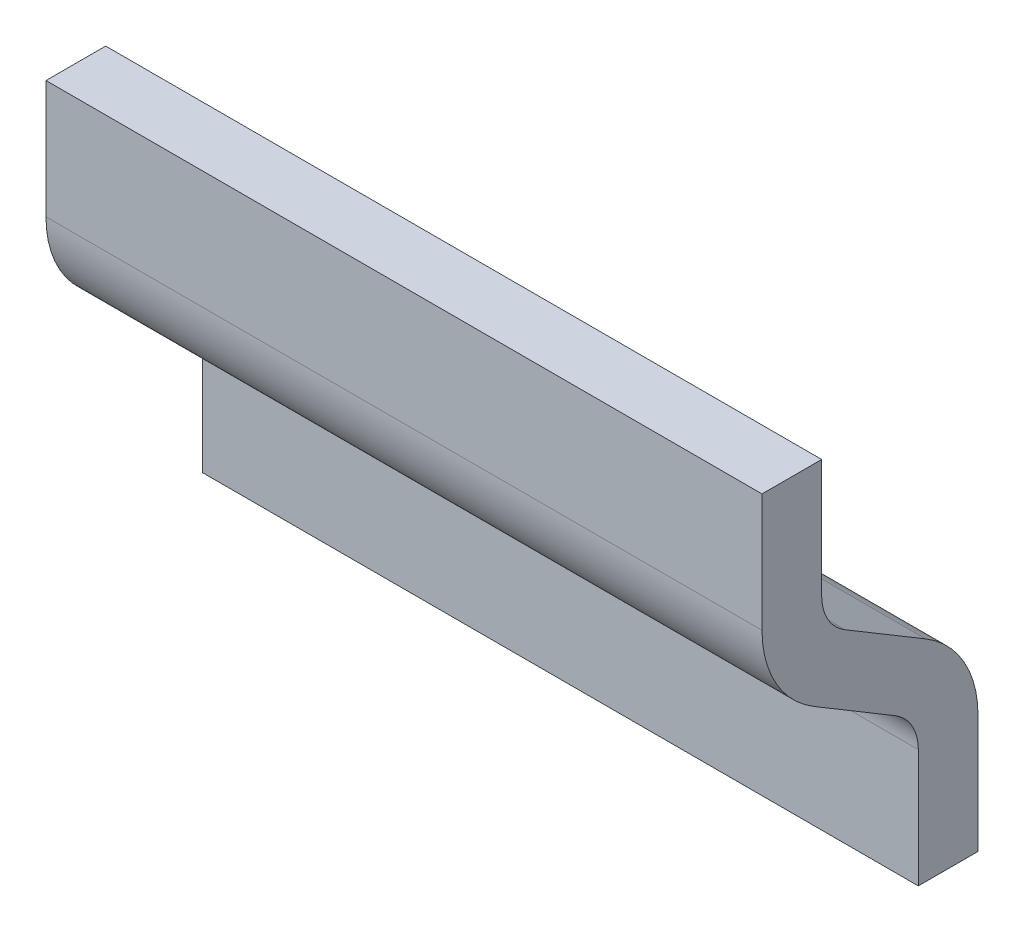
ISO-10303-21;
HEADER;
FILE_DESCRIPTION(('STEP AP214'),'2;1');
FILE_NAME('part.step','',(''),(''),'','','');
FILE_SCHEMA(('AUTOMOTIVE_DESIGN { 1 0 10303 214 1 1 1 1 }'));
ENDSEC;
DATA;
#1=APPLICATION_CONTEXT('core data for automotive mechanical design processes');
#2=APPLICATION_PROTOCOL_DEFINITION('international standard','automotive_design',2000,#1);
#3=PRODUCT_CONTEXT('',#1,'mechanical');
#4=PRODUCT('Part','Part','',(#3));
#5=PRODUCT_RELATED_PRODUCT_CATEGORY('part','',(#4));
#6=PRODUCT_DEFINITION_FORMATION('','',#4);
#7=PRODUCT_DEFINITION_CONTEXT('part definition',#1,'design');
#8=PRODUCT_DEFINITION('design','',#6,#7);
#9=PRODUCT_DEFINITION_SHAPE('','',#8);
#10=(LENGTH_UNIT() NAMED_UNIT(*) SI_UNIT(.MILLI.,.METRE.));
#11=(NAMED_UNIT(*) PLANE_ANGLE_UNIT() SI_UNIT($,.RADIAN.));
#12=(NAMED_UNIT(*) SI_UNIT($,.STERADIAN.) SOLID_ANGLE_UNIT());
#13=UNCERTAINTY_MEASURE_WITH_UNIT(LENGTH_MEASURE(1.E-05),#10,'distance_accuracy_value','');
#14=(GEOMETRIC_REPRESENTATION_CONTEXT(3) GLOBAL_UNCERTAINTY_ASSIGNED_CONTEXT((#13)) GLOBAL_UNIT_ASSIGNED_CONTEXT((#10,
#11,#12)) REPRESENTATION_CONTEXT('',''));
#15=CARTESIAN_POINT('',(0.,0.,0.));
#16=DIRECTION('',(0.,0.,1.));
#17=DIRECTION('',(1.,0.,0.));
#18=AXIS2_PLACEMENT_3D('',#15,#16,#17);
#19=CARTESIAN_POINT('',(0.,8.34480519481,-1.975));
#20=DIRECTION('',(1.,0.,0.));
#21=DIRECTION('',(0.,-0.493297580616371,0.869860619270717));
#22=AXIS2_PLACEMENT_3D('',#19,#20,#21);
#23=CYLINDRICAL_SURFACE('',#22,0.45);
#24=DIRECTION('',(1.,0.,0.));
#25=VECTOR('',#24,1.);
#26=CARTESIAN_POINT('',(0.,8.34480519481,-2.425));
#27=LINE('',#26,#25);
#28=CARTESIAN_POINT('',(-1.5,8.34480519481,-2.425));
#29=VERTEX_POINT('',#28);
#30=CARTESIAN_POINT('',(1.5,8.34480519481,-2.425));
#31=VERTEX_POINT('',#30);
#32=EDGE_CURVE('E11',#29,#31,#27,.T.);
#33=ORIENTED_EDGE('',*,*,#32,.F.);
#34=CARTESIAN_POINT('',(-1.5,8.34480519481,-1.975));
#35=DIRECTION('',(1.,0.,0.));
#36=DIRECTION('',(0.,-1.,0.));
#37=AXIS2_PLACEMENT_3D('',#34,#35,#36);
#38=CIRCLE('',#37,0.45);
#39=CARTESIAN_POINT('',(-1.5,8.73099531987,-2.20599174726));
#40=VERTEX_POINT('',#39);
#41=EDGE_CURVE('E25',#29,#40,#38,.T.);
#42=ORIENTED_EDGE('',*,*,#41,.T.);
#43=DIRECTION('',(1.,0.,0.));
#44=VECTOR('',#43,1.);
#45=CARTESIAN_POINT('',(0.,8.73099531987,-2.20599174726));
#46=LINE('',#45,#44);
#47=CARTESIAN_POINT('',(1.5,8.73099531987,-2.20599174726));
#48=VERTEX_POINT('',#47);
#49=EDGE_CURVE('E124',#40,#48,#46,.T.);
#50=ORIENTED_EDGE('',*,*,#49,.T.);
#51=CARTESIAN_POINT('',(1.5,8.34480519481,-1.975));
#52=DIRECTION('',(1.,0.,0.));
#53=DIRECTION('',(0.,-1.,0.));
#54=AXIS2_PLACEMENT_3D('',#51,#52,#53);
#55=CIRCLE('',#54,0.45);
#56=EDGE_CURVE('E223',#31,#48,#55,.T.);
#57=ORIENTED_EDGE('',*,*,#56,.F.);
#58=EDGE_LOOP('',(#33,#42,#50,#57));
#59=FACE_BOUND('',#58,.T.);
#60=ADVANCED_FACE('F17',(#59),#23,.T.);
#61=CARTESIAN_POINT('',(1.5,6.1,-1.5));
#62=DIRECTION('',(1.,0.,0.));
#63=DIRECTION('',(0.,-1.,0.));
#64=AXIS2_PLACEMENT_3D('',#61,#62,#63);
#65=PLANE('',#64);
#66=ORIENTED_EDGE('',*,*,#56,.T.);
#67=DIRECTION('',(0.,-0.513314993903098,-0.858200277927164));
#68=VECTOR('',#67,1.);
#69=CARTESIAN_POINT('',(1.5,8.83227503474,-2.03666437424));
#70=LINE('',#69,#68);
#71=CARTESIAN_POINT('',(1.5,8.93355474961,-1.86733700122));
#72=VERTEX_POINT('',#71);
#73=EDGE_CURVE('E219',#72,#48,#70,.T.);
#74=ORIENTED_EDGE('',*,*,#73,.F.);
#75=CARTESIAN_POINT('',(1.5,9.10519480519,-1.97));
#76=DIRECTION('',(1.,0.,0.));
#77=DIRECTION('',(0.,-1.,0.));
#78=AXIS2_PLACEMENT_3D('',#75,#76,#77);
#79=CIRCLE('',#78,0.2);
#80=CARTESIAN_POINT('',(1.5,9.10519480519,-1.77));
#81=VERTEX_POINT('',#80);
#82=EDGE_CURVE('E118',#81,#72,#79,.T.);
#83=ORIENTED_EDGE('',*,*,#82,.F.);
#84=DIRECTION('',(0.,-1.,0.));
#85=VECTOR('',#84,1.);
#86=CARTESIAN_POINT('',(1.5,9.3525974026,-1.77));
#87=LINE('',#86,#85);
#88=CARTESIAN_POINT('',(1.5,9.6,-1.77));
#89=VERTEX_POINT('',#88);
#90=EDGE_CURVE('E211',#89,#81,#87,.T.);
#91=ORIENTED_EDGE('',*,*,#90,.F.);
#92=DIRECTION('',(0.,0.,-1.));
#93=VECTOR('',#92,1.);
#94=CARTESIAN_POINT('',(1.5,9.6,-1.645));
#95=LINE('',#94,#93);
#96=CARTESIAN_POINT('',(1.5,9.6,-1.52));
#97=VERTEX_POINT('',#96);
#98=EDGE_CURVE('E206',#97,#89,#95,.T.);
#99=ORIENTED_EDGE('',*,*,#98,.F.);
#100=DIRECTION('',(0.,1.,0.));
#101=VECTOR('',#100,1.);
#102=CARTESIAN_POINT('',(1.5,9.3525974026,-1.52));
#103=LINE('',#102,#101);
#104=CARTESIAN_POINT('',(1.5,9.10519480519,-1.52));
#105=VERTEX_POINT('',#104);
#106=EDGE_CURVE('E201',#105,#97,#103,.T.);
#107=ORIENTED_EDGE('',*,*,#106,.F.);
#108=CARTESIAN_POINT('',(1.5,9.10519480519,-1.97));
#109=DIRECTION('',(1.,0.,0.));
#110=DIRECTION('',(0.,-1.,0.));
#111=AXIS2_PLACEMENT_3D('',#108,#109,#110);
#112=CIRCLE('',#111,0.45);
#113=CARTESIAN_POINT('',(1.5,8.71900468013,-1.73900825274));
#114=VERTEX_POINT('',#113);
#115=EDGE_CURVE('E197',#105,#114,#112,.T.);
#116=ORIENTED_EDGE('',*,*,#115,.T.);
#117=DIRECTION('',(0.,0.513314993903098,0.858200277927164));
#118=VECTOR('',#117,1.);
#119=CARTESIAN_POINT('',(1.5,8.61772496526,-1.90833562576));
#120=LINE('',#119,#118);
#121=CARTESIAN_POINT('',(1.5,8.51644525039,-2.07766299878));
#122=VERTEX_POINT('',#121);
#123=EDGE_CURVE('E192',#122,#114,#120,.T.);
#124=ORIENTED_EDGE('',*,*,#123,.F.);
#125=CARTESIAN_POINT('',(1.5,8.34480519481,-1.975));
#126=DIRECTION('',(1.,0.,0.));
#127=DIRECTION('',(0.,-1.,0.));
#128=AXIS2_PLACEMENT_3D('',#125,#126,#127);
#129=CIRCLE('',#128,0.2);
#130=CARTESIAN_POINT('',(1.5,8.34480519481,-2.175));
#131=VERTEX_POINT('',#130);
#132=EDGE_CURVE('E187',#131,#122,#129,.T.);
#133=ORIENTED_EDGE('',*,*,#132,.F.);
#134=DIRECTION('',(0.,1.,0.));
#135=VECTOR('',#134,1.);
#136=CARTESIAN_POINT('',(1.5,8.0974025974,-2.175));
#137=LINE('',#136,#135);
#138=CARTESIAN_POINT('',(1.5,7.85,-2.175));
#139=VERTEX_POINT('',#138);
#140=EDGE_CURVE('E182',#139,#131,#137,.T.);
#141=ORIENTED_EDGE('',*,*,#140,.F.);
#142=DIRECTION('',(0.,0.,1.));
#143=VECTOR('',#142,1.);
#144=CARTESIAN_POINT('',(1.5,7.85,-2.3));
#145=LINE('',#144,#143);
#146=CARTESIAN_POINT('',(1.5,7.85,-2.425));
#147=VERTEX_POINT('',#146);
#148=EDGE_CURVE('E177',#147,#139,#145,.T.);
#149=ORIENTED_EDGE('',*,*,#148,.F.);
#150=DIRECTION('',(0.,-1.,0.));
#151=VECTOR('',#150,1.);
#152=CARTESIAN_POINT('',(1.5,8.0974025974,-2.425));
#153=LINE('',#152,#151);
#154=EDGE_CURVE('E172',#31,#147,#153,.T.);
#155=ORIENTED_EDGE('',*,*,#154,.F.);
#156=EDGE_LOOP('',(#66,#74,#83,#91,#99,#107,#116,#124,#133,#141,#149,#155));
#157=FACE_BOUND('',#156,.T.);
#158=ADVANCED_FACE('F237',(#157),#65,.T.);
#159=CARTESIAN_POINT('',(0.,3.85519480519,-2.425));
#160=DIRECTION('',(0.,0.,-1.));
#161=DIRECTION('',(0.,1.,0.));
#162=AXIS2_PLACEMENT_3D('',#159,#160,#161);
#163=PLANE('',#162);
#164=DIRECTION('',(1.,0.,0.));
#165=VECTOR('',#164,1.);
#166=CARTESIAN_POINT('',(0.,7.85,-2.425));
#167=LINE('',#166,#165);
#168=CARTESIAN_POINT('',(-1.5,7.85,-2.425));
#169=VERTEX_POINT('',#168);
#170=EDGE_CURVE('E167',#169,#147,#167,.T.);
#171=ORIENTED_EDGE('',*,*,#170,.F.);
#172=DIRECTION('',(0.,-1.,0.));
#173=VECTOR('',#172,1.);
#174=CARTESIAN_POINT('',(-1.5,8.0974025974,-2.425));
#175=LINE('',#174,#173);
#176=EDGE_CURVE('E163',#29,#169,#175,.T.);
#177=ORIENTED_EDGE('',*,*,#176,.F.);
#178=ORIENTED_EDGE('',*,*,#32,.T.);
#179=ORIENTED_EDGE('',*,*,#154,.T.);
#180=EDGE_LOOP('',(#171,#177,#178,#179));
#181=FACE_BOUND('',#180,.T.);
#182=ADVANCED_FACE('F239',(#181),#163,.T.);
#183=CARTESIAN_POINT('',(-1.5,6.1,-1.5));
#184=DIRECTION('',(1.,0.,0.));
#185=DIRECTION('',(0.,-1.,0.));
#186=AXIS2_PLACEMENT_3D('',#183,#184,#185);
#187=PLANE('',#186);
#188=ORIENTED_EDGE('',*,*,#176,.T.);
#189=DIRECTION('',(0.,0.,1.));
#190=VECTOR('',#189,1.);
#191=CARTESIAN_POINT('',(-1.5,7.85,-2.3));
#192=LINE('',#191,#190);
#193=CARTESIAN_POINT('',(-1.5,7.85,-2.175));
#194=VERTEX_POINT('',#193);
#195=EDGE_CURVE('E159',#169,#194,#192,.T.);
#196=ORIENTED_EDGE('',*,*,#195,.T.);
#197=DIRECTION('',(0.,1.,0.));
#198=VECTOR('',#197,1.);
#199=CARTESIAN_POINT('',(-1.5,8.0974025974,-2.175));
#200=LINE('',#199,#198);
#201=CARTESIAN_POINT('',(-1.5,8.34480519481,-2.175));
#202=VERTEX_POINT('',#201);
#203=EDGE_CURVE('E155',#194,#202,#200,.T.);
#204=ORIENTED_EDGE('',*,*,#203,.T.);
#205=CARTESIAN_POINT('',(-1.5,8.34480519481,-1.975));
#206=DIRECTION('',(1.,0.,0.));
#207=DIRECTION('',(0.,-1.,0.));
#208=AXIS2_PLACEMENT_3D('',#205,#206,#207);
#209=CIRCLE('',#208,0.2);
#210=CARTESIAN_POINT('',(-1.5,8.51644525039,-2.07766299878));
#211=VERTEX_POINT('',#210);
#212=EDGE_CURVE('E151',#202,#211,#209,.T.);
#213=ORIENTED_EDGE('',*,*,#212,.T.);
#214=DIRECTION('',(0.,0.513314993903098,0.858200277927164));
#215=VECTOR('',#214,1.);
#216=CARTESIAN_POINT('',(-1.5,8.61772496526,-1.90833562576));
#217=LINE('',#216,#215);
#218=CARTESIAN_POINT('',(-1.5,8.71900468013,-1.73900825274));
#219=VERTEX_POINT('',#218);
#220=EDGE_CURVE('E147',#211,#219,#217,.T.);
#221=ORIENTED_EDGE('',*,*,#220,.T.);
#222=CARTESIAN_POINT('',(-1.5,9.10519480519,-1.97));
#223=DIRECTION('',(1.,0.,0.));
#224=DIRECTION('',(0.,-1.,0.));
#225=AXIS2_PLACEMENT_3D('',#222,#223,#224);
#226=CIRCLE('',#225,0.45);
#227=CARTESIAN_POINT('',(-1.5,9.10519480519,-1.52));
#228=VERTEX_POINT('',#227);
#229=EDGE_CURVE('E142',#228,#219,#226,.T.);
#230=ORIENTED_EDGE('',*,*,#229,.F.);
#231=DIRECTION('',(0.,1.,0.));
#232=VECTOR('',#231,1.);
#233=CARTESIAN_POINT('',(-1.5,9.3525974026,-1.52));
#234=LINE('',#233,#232);
#235=CARTESIAN_POINT('',(-1.5,9.6,-1.52));
#236=VERTEX_POINT('',#235);
#237=EDGE_CURVE('E138',#228,#236,#234,.T.);
#238=ORIENTED_EDGE('',*,*,#237,.T.);
#239=DIRECTION('',(0.,0.,-1.));
#240=VECTOR('',#239,1.);
#241=CARTESIAN_POINT('',(-1.5,9.6,-1.645));
#242=LINE('',#241,#240);
#243=CARTESIAN_POINT('',(-1.5,9.6,-1.77));
#244=VERTEX_POINT('',#243);
#245=EDGE_CURVE('E134',#236,#244,#242,.T.);
#246=ORIENTED_EDGE('',*,*,#245,.T.);
#247=DIRECTION('',(0.,-1.,0.));
#248=VECTOR('',#247,1.);
#249=CARTESIAN_POINT('',(-1.5,9.3525974026,-1.77));
#250=LINE('',#249,#248);
#251=CARTESIAN_POINT('',(-1.5,9.10519480519,-1.77));
#252=VERTEX_POINT('',#251);
#253=EDGE_CURVE('E109',#244,#252,#250,.T.);
#254=ORIENTED_EDGE('',*,*,#253,.T.);
#255=CARTESIAN_POINT('',(-1.5,9.10519480519,-1.97));
#256=DIRECTION('',(1.,0.,0.));
#257=DIRECTION('',(0.,-1.,0.));
#258=AXIS2_PLACEMENT_3D('',#255,#256,#257);
#259=CIRCLE('',#258,0.2);
#260=CARTESIAN_POINT('',(-1.5,8.93355474961,-1.86733700122));
#261=VERTEX_POINT('',#260);
#262=EDGE_CURVE('E101',#252,#261,#259,.T.);
#263=ORIENTED_EDGE('',*,*,#262,.T.);
#264=DIRECTION('',(0.,-0.513314993903098,-0.858200277927164));
#265=VECTOR('',#264,1.);
#266=CARTESIAN_POINT('',(-1.5,8.83227503474,-2.03666437424));
#267=LINE('',#266,#265);
#268=EDGE_CURVE('E106',#261,#40,#267,.T.);
#269=ORIENTED_EDGE('',*,*,#268,.T.);
#270=ORIENTED_EDGE('',*,*,#41,.F.);
#271=EDGE_LOOP('',(#188,#196,#204,#213,#221,#230,#238,#246,#254,#263,#269,#270));
#272=FACE_BOUND('',#271,.T.);
#273=ADVANCED_FACE('F104',(#272),#187,.F.);
#274=CARTESIAN_POINT('',(0.,8.93355474961,-1.86733700122));
#275=DIRECTION('',(0.,-0.858200277927164,0.513314993903098));
#276=DIRECTION('',(0.,-0.513314993903098,-0.858200277927164));
#277=AXIS2_PLACEMENT_3D('',#274,#275,#276);
#278=PLANE('',#277);
#279=ORIENTED_EDGE('',*,*,#49,.F.);
#280=ORIENTED_EDGE('',*,*,#268,.F.);
#281=DIRECTION('',(1.,0.,0.));
#282=VECTOR('',#281,1.);
#283=CARTESIAN_POINT('',(0.,8.93355474961,-1.86733700122));
#284=LINE('',#283,#282);
#285=EDGE_CURVE('E116',#261,#72,#284,.T.);
#286=ORIENTED_EDGE('',*,*,#285,.T.);
#287=ORIENTED_EDGE('',*,*,#73,.T.);
#288=EDGE_LOOP('',(#279,#280,#286,#287));
#289=FACE_BOUND('',#288,.T.);
#290=ADVANCED_FACE('F123',(#289),#278,.F.);
#291=CARTESIAN_POINT('',(0.,9.10519480519,-1.97));
#292=DIRECTION('',(1.,0.,0.));
#293=DIRECTION('',(0.,0.493297580618037,-0.869860619269772));
#294=AXIS2_PLACEMENT_3D('',#291,#292,#293);
#295=CYLINDRICAL_SURFACE('',#294,0.2);
#296=ORIENTED_EDGE('',*,*,#285,.F.);
#297=ORIENTED_EDGE('',*,*,#262,.F.);
#298=DIRECTION('',(1.,0.,0.));
#299=VECTOR('',#298,1.);
#300=CARTESIAN_POINT('',(0.,9.10519480519,-1.77));
#301=LINE('',#300,#299);
#302=EDGE_CURVE('E121',#252,#81,#301,.T.);
#303=ORIENTED_EDGE('',*,*,#302,.T.);
#304=ORIENTED_EDGE('',*,*,#82,.T.);
#305=EDGE_LOOP('',(#296,#297,#303,#304));
#306=FACE_BOUND('',#305,.T.);
#307=ADVANCED_FACE('F117',(#306),#295,.F.);
#308=CARTESIAN_POINT('',(0.,2.6,-1.77));
#309=DIRECTION('',(0.,0.,-1.));
#310=DIRECTION('',(0.,1.,0.));
#311=AXIS2_PLACEMENT_3D('',#308,#309,#310);
#312=PLANE('',#311);
#313=ORIENTED_EDGE('',*,*,#302,.F.);
#314=ORIENTED_EDGE('',*,*,#253,.F.);
#315=DIRECTION('',(1.,0.,0.));
#316=VECTOR('',#315,1.);
#317=CARTESIAN_POINT('',(0.,9.6,-1.77));
#318=LINE('',#317,#316);
#319=EDGE_CURVE('E284',#244,#89,#318,.T.);
#320=ORIENTED_EDGE('',*,*,#319,.T.);
#321=ORIENTED_EDGE('',*,*,#90,.T.);
#322=EDGE_LOOP('',(#313,#314,#320,#321));
#323=FACE_BOUND('',#322,.T.);
#324=ADVANCED_FACE('F288',(#323),#312,.T.);
#325=CARTESIAN_POINT('',(0.,9.6,-1.52));
#326=DIRECTION('',(0.,-1.,0.));
#327=DIRECTION('',(0.,0.,-1.));
#328=AXIS2_PLACEMENT_3D('',#325,#326,#327);
#329=PLANE('',#328);
#330=ORIENTED_EDGE('',*,*,#319,.F.);
#331=ORIENTED_EDGE('',*,*,#245,.F.);
#332=DIRECTION('',(1.,0.,0.));
#333=VECTOR('',#332,1.);
#334=CARTESIAN_POINT('',(0.,9.6,-1.52));
#335=LINE('',#334,#333);
#336=EDGE_CURVE('E275',#236,#97,#335,.T.);
#337=ORIENTED_EDGE('',*,*,#336,.T.);
#338=ORIENTED_EDGE('',*,*,#98,.T.);
#339=EDGE_LOOP('',(#330,#331,#337,#338));
#340=FACE_BOUND('',#339,.T.);
#341=ADVANCED_FACE('F285',(#340),#329,.F.);
#342=CARTESIAN_POINT('',(0.,3.09480519481,-1.52));
#343=DIRECTION('',(0.,0.,1.));
#344=DIRECTION('',(0.,-1.,0.));
#345=AXIS2_PLACEMENT_3D('',#342,#343,#344);
#346=PLANE('',#345);
#347=ORIENTED_EDGE('',*,*,#336,.F.);
#348=ORIENTED_EDGE('',*,*,#237,.F.);
#349=DIRECTION('',(1.,0.,0.));
#350=VECTOR('',#349,1.);
#351=CARTESIAN_POINT('',(0.,9.10519480519,-1.52));
#352=LINE('',#351,#350);
#353=EDGE_CURVE('E269',#228,#105,#352,.T.);
#354=ORIENTED_EDGE('',*,*,#353,.T.);
#355=ORIENTED_EDGE('',*,*,#106,.T.);
#356=EDGE_LOOP('',(#347,#348,#354,#355));
#357=FACE_BOUND('',#356,.T.);
#358=ADVANCED_FACE('F278',(#357),#346,.T.);
#359=CARTESIAN_POINT('',(0.,9.10519480519,-1.97));
#360=DIRECTION('',(1.,0.,0.));
#361=DIRECTION('',(0.,0.49329758061637,-0.869860619270718));
#362=AXIS2_PLACEMENT_3D('',#359,#360,#361);
#363=CYLINDRICAL_SURFACE('',#362,0.45);
#364=ORIENTED_EDGE('',*,*,#353,.F.);
#365=ORIENTED_EDGE('',*,*,#229,.T.);
#366=DIRECTION('',(1.,0.,0.));
#367=VECTOR('',#366,1.);
#368=CARTESIAN_POINT('',(0.,8.71900468013,-1.73900825274));
#369=LINE('',#368,#367);
#370=EDGE_CURVE('E265',#219,#114,#369,.T.);
#371=ORIENTED_EDGE('',*,*,#370,.T.);
#372=ORIENTED_EDGE('',*,*,#115,.F.);
#373=EDGE_LOOP('',(#364,#365,#371,#372));
#374=FACE_BOUND('',#373,.T.);
#375=ADVANCED_FACE('F271',(#374),#363,.T.);
#376=CARTESIAN_POINT('',(0.,8.51644525039,-2.07766299878));
#377=DIRECTION('',(0.,0.858200277927164,-0.513314993903098));
#378=DIRECTION('',(0.,0.513314993903098,0.858200277927164));
#379=AXIS2_PLACEMENT_3D('',#376,#377,#378);
#380=PLANE('',#379);
#381=ORIENTED_EDGE('',*,*,#370,.F.);
#382=ORIENTED_EDGE('',*,*,#220,.F.);
#383=DIRECTION('',(1.,0.,0.));
#384=VECTOR('',#383,1.);
#385=CARTESIAN_POINT('',(0.,8.51644525039,-2.07766299878));
#386=LINE('',#385,#384);
#387=EDGE_CURVE('E255',#211,#122,#386,.T.);
#388=ORIENTED_EDGE('',*,*,#387,.T.);
#389=ORIENTED_EDGE('',*,*,#123,.T.);
#390=EDGE_LOOP('',(#381,#382,#388,#389));
#391=FACE_BOUND('',#390,.T.);
#392=ADVANCED_FACE('F266',(#391),#380,.F.);
#393=CARTESIAN_POINT('',(0.,8.34480519481,-1.975));
#394=DIRECTION('',(1.,0.,0.));
#395=DIRECTION('',(0.,-0.493297580618036,0.869860619269773));
#396=AXIS2_PLACEMENT_3D('',#393,#394,#395);
#397=CYLINDRICAL_SURFACE('',#396,0.2);
#398=ORIENTED_EDGE('',*,*,#387,.F.);
#399=ORIENTED_EDGE('',*,*,#212,.F.);
#400=DIRECTION('',(1.,0.,0.));
#401=VECTOR('',#400,1.);
#402=CARTESIAN_POINT('',(0.,8.34480519481,-2.175));
#403=LINE('',#402,#401);
#404=EDGE_CURVE('E249',#202,#131,#403,.T.);
#405=ORIENTED_EDGE('',*,*,#404,.T.);
#406=ORIENTED_EDGE('',*,*,#132,.T.);
#407=EDGE_LOOP('',(#398,#399,#405,#406));
#408=FACE_BOUND('',#407,.T.);
#409=ADVANCED_FACE('F258',(#408),#397,.F.);
#410=CARTESIAN_POINT('',(0.,4.35,-2.175));
#411=DIRECTION('',(0.,0.,1.));
#412=DIRECTION('',(0.,-1.,0.));
#413=AXIS2_PLACEMENT_3D('',#410,#411,#412);
#414=PLANE('',#413);
#415=ORIENTED_EDGE('',*,*,#404,.F.);
#416=ORIENTED_EDGE('',*,*,#203,.F.);
#417=DIRECTION('',(1.,0.,0.));
#418=VECTOR('',#417,1.);
#419=CARTESIAN_POINT('',(0.,7.85,-2.175));
#420=LINE('',#419,#418);
#421=EDGE_CURVE('E246',#194,#139,#420,.T.);
#422=ORIENTED_EDGE('',*,*,#421,.T.);
#423=ORIENTED_EDGE('',*,*,#140,.T.);
#424=EDGE_LOOP('',(#415,#416,#422,#423));
#425=FACE_BOUND('',#424,.T.);
#426=ADVANCED_FACE('F251',(#425),#414,.T.);
#427=CARTESIAN_POINT('',(0.,7.85,-2.425));
#428=DIRECTION('',(0.,1.,0.));
#429=DIRECTION('',(0.,0.,1.));
#430=AXIS2_PLACEMENT_3D('',#427,#428,#429);
#431=PLANE('',#430);
#432=ORIENTED_EDGE('',*,*,#421,.F.);
#433=ORIENTED_EDGE('',*,*,#195,.F.);
#434=ORIENTED_EDGE('',*,*,#170,.T.);
#435=ORIENTED_EDGE('',*,*,#148,.T.);
#436=EDGE_LOOP('',(#432,#433,#434,#435));
#437=FACE_BOUND('',#436,.T.);
#438=ADVANCED_FACE('F247',(#437),#431,.F.);
#439=CLOSED_SHELL('',(#60,#158,#182,#273,#290,#307,#324,#341,#358,#375,#392,#409,#426,#438));
#440=MANIFOLD_SOLID_BREP('B1',#439);
#441=ADVANCED_BREP_SHAPE_REPRESENTATION('',(#18,#440),#14);
#442=SHAPE_DEFINITION_REPRESENTATION(#9,#441);
ENDSEC;
END-ISO-10303-21;
